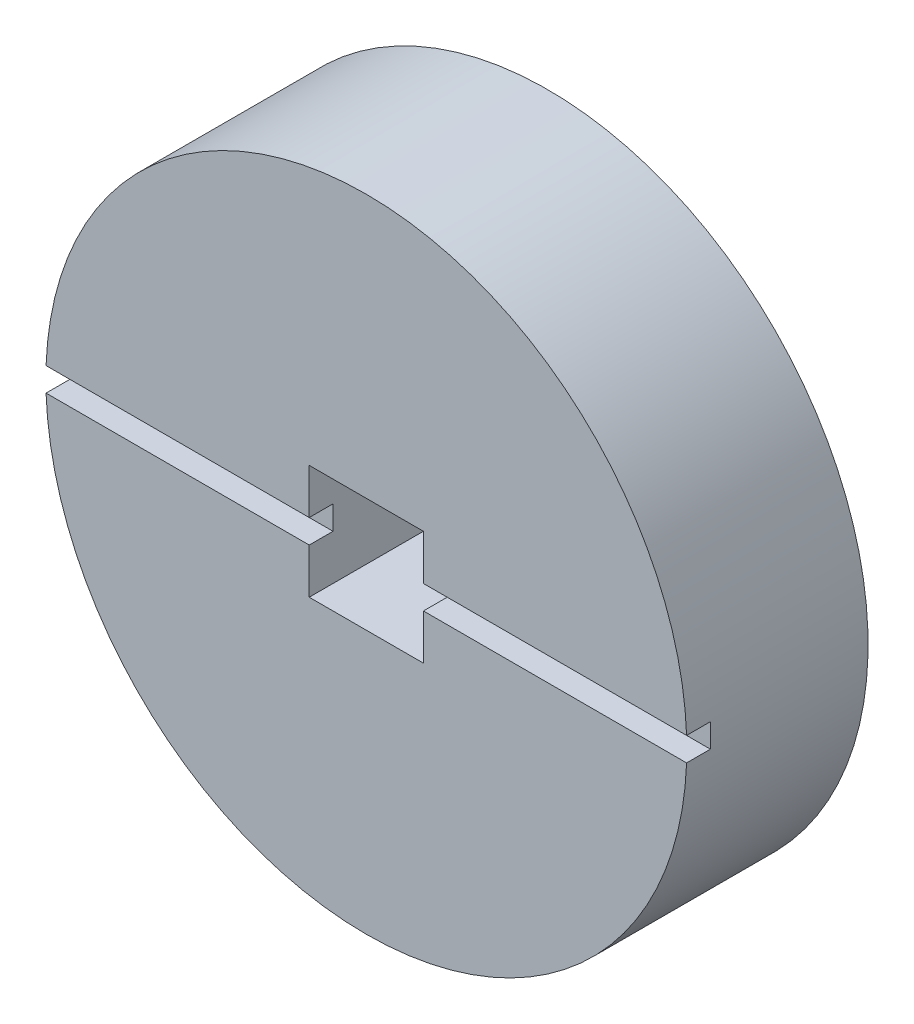
ISO-10303-21;
HEADER;
FILE_DESCRIPTION(('STEP AP214'),'2;1');
FILE_NAME('part.step','',(''),(''),'','','');
FILE_SCHEMA(('AUTOMOTIVE_DESIGN { 1 0 10303 214 1 1 1 1 }'));
ENDSEC;
DATA;
#1=APPLICATION_CONTEXT('core data for automotive mechanical design processes');
#2=APPLICATION_PROTOCOL_DEFINITION('international standard','automotive_design',2000,#1);
#3=PRODUCT_CONTEXT('',#1,'mechanical');
#4=PRODUCT('Part','Part','',(#3));
#5=PRODUCT_RELATED_PRODUCT_CATEGORY('part','',(#4));
#6=PRODUCT_DEFINITION_FORMATION('','',#4);
#7=PRODUCT_DEFINITION_CONTEXT('part definition',#1,'design');
#8=PRODUCT_DEFINITION('design','',#6,#7);
#9=PRODUCT_DEFINITION_SHAPE('','',#8);
#10=(LENGTH_UNIT() NAMED_UNIT(*) SI_UNIT(.MILLI.,.METRE.));
#11=(NAMED_UNIT(*) PLANE_ANGLE_UNIT() SI_UNIT($,.RADIAN.));
#12=(NAMED_UNIT(*) SI_UNIT($,.STERADIAN.) SOLID_ANGLE_UNIT());
#13=UNCERTAINTY_MEASURE_WITH_UNIT(LENGTH_MEASURE(1.E-05),#10,'distance_accuracy_value','');
#14=(GEOMETRIC_REPRESENTATION_CONTEXT(3) GLOBAL_UNCERTAINTY_ASSIGNED_CONTEXT((#13)) GLOBAL_UNIT_ASSIGNED_CONTEXT((#10,
#11,#12)) REPRESENTATION_CONTEXT('',''));
#15=CARTESIAN_POINT('',(0.,0.,0.));
#16=DIRECTION('',(0.,0.,1.));
#17=DIRECTION('',(1.,0.,0.));
#18=AXIS2_PLACEMENT_3D('',#15,#16,#17);
#19=CARTESIAN_POINT('',(176.372942693362,103.404109270251,-15.875));
#20=DIRECTION('',(0.,0.,1.));
#21=DIRECTION('',(1.,0.,0.));
#22=AXIS2_PLACEMENT_3D('',#19,#20,#21);
#23=PLANE('',#22);
#24=DIRECTION('',(1.,0.,0.));
#25=VECTOR('',#24,1.);
#26=CARTESIAN_POINT('',(162.750670816935,103.154109270251,-15.875));
#27=LINE('',#26,#25);
#28=CARTESIAN_POINT('',(169.641846837595,103.154109270251,-15.875));
#29=VERTEX_POINT('',#28);
#30=CARTESIAN_POINT('',(175.172942693362,103.154109270251,-15.875));
#31=VERTEX_POINT('',#30);
#32=EDGE_CURVE('E177',#29,#31,#27,.T.);
#33=ORIENTED_EDGE('',*,*,#32,.F.);
#34=CARTESIAN_POINT('',(176.372942693362,103.404109270251,-15.875));
#35=DIRECTION('',(0.,0.,1.));
#36=DIRECTION('',(1.,0.,0.));
#37=AXIS2_PLACEMENT_3D('',#34,#35,#36);
#38=CIRCLE('',#37,6.73573688764091);
#39=CARTESIAN_POINT('',(183.104038549129,103.154109270251,-15.875));
#40=VERTEX_POINT('',#39);
#41=EDGE_CURVE('E149',#29,#40,#38,.T.);
#42=ORIENTED_EDGE('',*,*,#41,.T.);
#43=CARTESIAN_POINT('',(177.572942693362,103.154109270251,-15.875));
#44=VERTEX_POINT('',#43);
#45=EDGE_CURVE('E140',#44,#40,#27,.T.);
#46=ORIENTED_EDGE('',*,*,#45,.F.);
#47=DIRECTION('',(0.,1.,0.));
#48=VECTOR('',#47,1.);
#49=CARTESIAN_POINT('',(177.572942693362,104.604109270251,-15.875));
#50=LINE('',#49,#48);
#51=CARTESIAN_POINT('',(177.572942693362,102.204109270251,-15.875));
#52=VERTEX_POINT('',#51);
#53=EDGE_CURVE('E205',#52,#44,#50,.T.);
#54=ORIENTED_EDGE('',*,*,#53,.F.);
#55=DIRECTION('',(1.,0.,0.));
#56=VECTOR('',#55,1.);
#57=CARTESIAN_POINT('',(175.172942693362,102.204109270251,-15.875));
#58=LINE('',#57,#56);
#59=CARTESIAN_POINT('',(175.172942693362,102.204109270251,-15.875));
#60=VERTEX_POINT('',#59);
#61=EDGE_CURVE('E196',#60,#52,#58,.T.);
#62=ORIENTED_EDGE('',*,*,#61,.F.);
#63=DIRECTION('',(0.,-1.,0.));
#64=VECTOR('',#63,1.);
#65=CARTESIAN_POINT('',(175.172942693362,104.604109270251,-15.875));
#66=LINE('',#65,#64);
#67=EDGE_CURVE('E211',#31,#60,#66,.T.);
#68=ORIENTED_EDGE('',*,*,#67,.F.);
#69=EDGE_LOOP('',(#33,#42,#46,#54,#62,#68));
#70=FACE_BOUND('',#69,.T.);
#71=ADVANCED_FACE('F33',(#70),#23,.T.);
#72=CARTESIAN_POINT('',(208.28,20.6375,-19.685));
#73=DIRECTION('',(0.,0.,-1.));
#74=DIRECTION('',(-1.,0.,0.));
#75=AXIS2_PLACEMENT_3D('',#72,#73,#74);
#76=PLANE('',#75);
#77=CARTESIAN_POINT('',(176.372942693362,103.404109270251,-19.685));
#78=DIRECTION('',(0.,0.,-1.));
#79=DIRECTION('',(-1.,0.,0.));
#80=AXIS2_PLACEMENT_3D('',#77,#78,#79);
#81=CIRCLE('',#80,6.73573688764091);
#82=CARTESIAN_POINT('',(169.637205805721,103.404109270251,-19.685));
#83=VERTEX_POINT('',#82);
#84=EDGE_CURVE('E148',#83,#83,#81,.F.);
#85=ORIENTED_EDGE('',*,*,#84,.F.);
#86=EDGE_LOOP('',(#85));
#87=FACE_BOUND('',#86,.T.);
#88=ADVANCED_FACE('F35',(#87),#76,.T.);
#89=DIRECTION('',(-1.,0.,0.));
#90=VECTOR('',#89,1.);
#91=CARTESIAN_POINT('',(162.750670816935,103.654109270251,-15.875));
#92=LINE('',#91,#90);
#93=CARTESIAN_POINT('',(183.104038549129,103.654109270251,-15.875));
#94=VERTEX_POINT('',#93);
#95=CARTESIAN_POINT('',(177.572942693362,103.654109270251,-15.875));
#96=VERTEX_POINT('',#95);
#97=EDGE_CURVE('E124',#94,#96,#92,.T.);
#98=ORIENTED_EDGE('',*,*,#97,.F.);
#99=CARTESIAN_POINT('',(169.641846837595,103.654109270251,-15.875));
#100=VERTEX_POINT('',#99);
#101=EDGE_CURVE('E137',#94,#100,#38,.T.);
#102=ORIENTED_EDGE('',*,*,#101,.T.);
#103=CARTESIAN_POINT('',(175.172942693362,103.654109270251,-15.875));
#104=VERTEX_POINT('',#103);
#105=EDGE_CURVE('E141',#104,#100,#92,.T.);
#106=ORIENTED_EDGE('',*,*,#105,.F.);
#107=CARTESIAN_POINT('',(175.172942693362,104.604109270251,-15.875));
#108=VERTEX_POINT('',#107);
#109=EDGE_CURVE('E166',#108,#104,#66,.T.);
#110=ORIENTED_EDGE('',*,*,#109,.F.);
#111=DIRECTION('',(-1.,0.,0.));
#112=VECTOR('',#111,1.);
#113=CARTESIAN_POINT('',(175.172942693362,104.604109270251,-15.875));
#114=LINE('',#113,#112);
#115=CARTESIAN_POINT('',(177.572942693362,104.604109270251,-15.875));
#116=VERTEX_POINT('',#115);
#117=EDGE_CURVE('E208',#116,#108,#114,.T.);
#118=ORIENTED_EDGE('',*,*,#117,.F.);
#119=EDGE_CURVE('E139',#96,#116,#50,.T.);
#120=ORIENTED_EDGE('',*,*,#119,.F.);
#121=EDGE_LOOP('',(#98,#102,#106,#110,#118,#120));
#122=FACE_BOUND('',#121,.T.);
#123=ADVANCED_FACE('F135',(#122),#23,.T.);
#124=CARTESIAN_POINT('',(176.372942693362,103.404109270251,-38.736540918157));
#125=DIRECTION('',(0.,0.,1.));
#126=DIRECTION('',(1.,0.,0.));
#127=AXIS2_PLACEMENT_3D('',#124,#125,#126);
#128=CYLINDRICAL_SURFACE('',#127,6.73573688764091);
#129=DIRECTION('',(0.,0.,1.));
#130=VECTOR('',#129,1.);
#131=CARTESIAN_POINT('',(169.641846837595,103.154109270251,-38.736540918157));
#132=LINE('',#131,#130);
#133=CARTESIAN_POINT('',(169.641846837595,103.154109270251,-16.375));
#134=VERTEX_POINT('',#133);
#135=EDGE_CURVE('E188',#134,#29,#132,.T.);
#136=ORIENTED_EDGE('',*,*,#135,.F.);
#137=CARTESIAN_POINT('',(176.372942693362,103.404109270251,-16.375));
#138=DIRECTION('',(0.,0.,1.));
#139=DIRECTION('',(1.,0.,0.));
#140=AXIS2_PLACEMENT_3D('',#137,#138,#139);
#141=CIRCLE('',#140,6.73573688764091);
#142=CARTESIAN_POINT('',(169.641846837595,103.654109270251,-16.375));
#143=VERTEX_POINT('',#142);
#144=EDGE_CURVE('E182',#134,#143,#141,.F.);
#145=ORIENTED_EDGE('',*,*,#144,.T.);
#146=DIRECTION('',(0.,0.,1.));
#147=VECTOR('',#146,1.);
#148=CARTESIAN_POINT('',(169.641846837595,103.654109270251,-38.736540918157));
#149=LINE('',#148,#147);
#150=EDGE_CURVE('E129',#100,#143,#149,.F.);
#151=ORIENTED_EDGE('',*,*,#150,.F.);
#152=ORIENTED_EDGE('',*,*,#101,.F.);
#153=DIRECTION('',(0.,0.,1.));
#154=VECTOR('',#153,1.);
#155=CARTESIAN_POINT('',(183.104038549129,103.654109270251,-38.736540918157));
#156=LINE('',#155,#154);
#157=CARTESIAN_POINT('',(183.104038549129,103.654109270251,-16.375));
#158=VERTEX_POINT('',#157);
#159=EDGE_CURVE('E121',#158,#94,#156,.T.);
#160=ORIENTED_EDGE('',*,*,#159,.F.);
#161=CARTESIAN_POINT('',(183.104038549129,103.154109270251,-16.375));
#162=VERTEX_POINT('',#161);
#163=EDGE_CURVE('E180',#158,#162,#141,.F.);
#164=ORIENTED_EDGE('',*,*,#163,.T.);
#165=DIRECTION('',(0.,0.,1.));
#166=VECTOR('',#165,1.);
#167=CARTESIAN_POINT('',(183.104038549129,103.154109270251,-38.736540918157));
#168=LINE('',#167,#166);
#169=EDGE_CURVE('E190',#40,#162,#168,.F.);
#170=ORIENTED_EDGE('',*,*,#169,.F.);
#171=ORIENTED_EDGE('',*,*,#41,.F.);
#172=EDGE_LOOP('',(#136,#145,#151,#152,#160,#164,#170,#171));
#173=FACE_BOUND('',#172,.T.);
#174=ORIENTED_EDGE('',*,*,#84,.T.);
#175=EDGE_LOOP('',(#174));
#176=FACE_BOUND('',#175,.T.);
#177=ADVANCED_FACE('F145',(#173,#176),#128,.T.);
#178=CARTESIAN_POINT('',(177.572942693362,104.604109270251,-18.796));
#179=DIRECTION('',(1.,0.,0.));
#180=DIRECTION('',(0.,0.,-1.));
#181=AXIS2_PLACEMENT_3D('',#178,#179,#180);
#182=PLANE('',#181);
#183=ORIENTED_EDGE('',*,*,#53,.T.);
#184=DIRECTION('',(0.,0.,-1.));
#185=VECTOR('',#184,1.);
#186=CARTESIAN_POINT('',(177.572942693362,103.154109270251,-18.796));
#187=LINE('',#186,#185);
#188=CARTESIAN_POINT('',(177.572942693362,103.154109270251,-16.375));
#189=VERTEX_POINT('',#188);
#190=EDGE_CURVE('E185',#44,#189,#187,.T.);
#191=ORIENTED_EDGE('',*,*,#190,.T.);
#192=DIRECTION('',(0.,-1.,0.));
#193=VECTOR('',#192,1.);
#194=CARTESIAN_POINT('',(177.572942693362,104.604109270251,-16.375));
#195=LINE('',#194,#193);
#196=CARTESIAN_POINT('',(177.572942693362,103.654109270251,-16.375));
#197=VERTEX_POINT('',#196);
#198=EDGE_CURVE('E178',#197,#189,#195,.T.);
#199=ORIENTED_EDGE('',*,*,#198,.F.);
#200=DIRECTION('',(0.,0.,1.));
#201=VECTOR('',#200,1.);
#202=CARTESIAN_POINT('',(177.572942693362,103.654109270251,-18.796));
#203=LINE('',#202,#201);
#204=EDGE_CURVE('E130',#197,#96,#203,.T.);
#205=ORIENTED_EDGE('',*,*,#204,.T.);
#206=ORIENTED_EDGE('',*,*,#119,.T.);
#207=DIRECTION('',(0.,0.,1.));
#208=VECTOR('',#207,1.);
#209=CARTESIAN_POINT('',(177.572942693362,104.604109270251,-18.796));
#210=LINE('',#209,#208);
#211=CARTESIAN_POINT('',(177.572942693362,104.604109270251,-18.796));
#212=VERTEX_POINT('',#211);
#213=EDGE_CURVE('E157',#212,#116,#210,.T.);
#214=ORIENTED_EDGE('',*,*,#213,.F.);
#215=DIRECTION('',(0.,1.,0.));
#216=VECTOR('',#215,1.);
#217=CARTESIAN_POINT('',(177.572942693362,104.604109270251,-18.796));
#218=LINE('',#217,#216);
#219=CARTESIAN_POINT('',(177.572942693362,102.204109270251,-18.796));
#220=VERTEX_POINT('',#219);
#221=EDGE_CURVE('E192',#220,#212,#218,.T.);
#222=ORIENTED_EDGE('',*,*,#221,.F.);
#223=DIRECTION('',(0.,0.,1.));
#224=VECTOR('',#223,1.);
#225=CARTESIAN_POINT('',(177.572942693362,102.204109270251,-18.796));
#226=LINE('',#225,#224);
#227=EDGE_CURVE('E155',#220,#52,#226,.T.);
#228=ORIENTED_EDGE('',*,*,#227,.T.);
#229=EDGE_LOOP('',(#183,#191,#199,#205,#206,#214,#222,#228));
#230=FACE_BOUND('',#229,.T.);
#231=ADVANCED_FACE('F226',(#230),#182,.F.);
#232=CARTESIAN_POINT('',(175.172942693362,102.204109270251,-18.796));
#233=DIRECTION('',(0.,-1.,0.));
#234=DIRECTION('',(0.,0.,-1.));
#235=AXIS2_PLACEMENT_3D('',#232,#233,#234);
#236=PLANE('',#235);
#237=ORIENTED_EDGE('',*,*,#61,.T.);
#238=ORIENTED_EDGE('',*,*,#227,.F.);
#239=DIRECTION('',(1.,0.,0.));
#240=VECTOR('',#239,1.);
#241=CARTESIAN_POINT('',(175.172942693362,102.204109270251,-18.796));
#242=LINE('',#241,#240);
#243=CARTESIAN_POINT('',(175.172942693362,102.204109270251,-18.796));
#244=VERTEX_POINT('',#243);
#245=EDGE_CURVE('E202',#244,#220,#242,.T.);
#246=ORIENTED_EDGE('',*,*,#245,.F.);
#247=DIRECTION('',(0.,0.,1.));
#248=VECTOR('',#247,1.);
#249=CARTESIAN_POINT('',(175.172942693362,102.204109270251,-18.796));
#250=LINE('',#249,#248);
#251=EDGE_CURVE('E216',#244,#60,#250,.T.);
#252=ORIENTED_EDGE('',*,*,#251,.T.);
#253=EDGE_LOOP('',(#237,#238,#246,#252));
#254=FACE_BOUND('',#253,.T.);
#255=ADVANCED_FACE('F244',(#254),#236,.F.);
#256=CARTESIAN_POINT('',(175.172942693362,104.604109270251,-18.796));
#257=DIRECTION('',(-1.,0.,0.));
#258=DIRECTION('',(0.,0.,1.));
#259=AXIS2_PLACEMENT_3D('',#256,#257,#258);
#260=PLANE('',#259);
#261=DIRECTION('',(0.,1.,0.));
#262=VECTOR('',#261,1.);
#263=CARTESIAN_POINT('',(175.172942693362,104.604109270251,-16.375));
#264=LINE('',#263,#262);
#265=CARTESIAN_POINT('',(175.172942693362,103.154109270251,-16.375));
#266=VERTEX_POINT('',#265);
#267=CARTESIAN_POINT('',(175.172942693362,103.654109270251,-16.375));
#268=VERTEX_POINT('',#267);
#269=EDGE_CURVE('E152',#266,#268,#264,.T.);
#270=ORIENTED_EDGE('',*,*,#269,.F.);
#271=DIRECTION('',(0.,0.,1.));
#272=VECTOR('',#271,1.);
#273=CARTESIAN_POINT('',(175.172942693362,103.154109270251,-18.796));
#274=LINE('',#273,#272);
#275=EDGE_CURVE('E11',#266,#31,#274,.T.);
#276=ORIENTED_EDGE('',*,*,#275,.T.);
#277=ORIENTED_EDGE('',*,*,#67,.T.);
#278=ORIENTED_EDGE('',*,*,#251,.F.);
#279=DIRECTION('',(0.,-1.,0.));
#280=VECTOR('',#279,1.);
#281=CARTESIAN_POINT('',(175.172942693362,104.604109270251,-18.796));
#282=LINE('',#281,#280);
#283=CARTESIAN_POINT('',(175.172942693362,104.604109270251,-18.796));
#284=VERTEX_POINT('',#283);
#285=EDGE_CURVE('E199',#284,#244,#282,.T.);
#286=ORIENTED_EDGE('',*,*,#285,.F.);
#287=DIRECTION('',(0.,0.,1.));
#288=VECTOR('',#287,1.);
#289=CARTESIAN_POINT('',(175.172942693362,104.604109270251,-18.796));
#290=LINE('',#289,#288);
#291=EDGE_CURVE('E218',#284,#108,#290,.T.);
#292=ORIENTED_EDGE('',*,*,#291,.T.);
#293=ORIENTED_EDGE('',*,*,#109,.T.);
#294=DIRECTION('',(0.,0.,-1.));
#295=VECTOR('',#294,1.);
#296=CARTESIAN_POINT('',(175.172942693362,103.654109270251,-18.796));
#297=LINE('',#296,#295);
#298=EDGE_CURVE('E41',#104,#268,#297,.T.);
#299=ORIENTED_EDGE('',*,*,#298,.T.);
#300=EDGE_LOOP('',(#270,#276,#277,#278,#286,#292,#293,#299));
#301=FACE_BOUND('',#300,.T.);
#302=ADVANCED_FACE('F164',(#301),#260,.F.);
#303=CARTESIAN_POINT('',(175.172942693362,104.604109270251,-18.796));
#304=DIRECTION('',(0.,1.,0.));
#305=DIRECTION('',(0.,0.,1.));
#306=AXIS2_PLACEMENT_3D('',#303,#304,#305);
#307=PLANE('',#306);
#308=ORIENTED_EDGE('',*,*,#117,.T.);
#309=ORIENTED_EDGE('',*,*,#291,.F.);
#310=DIRECTION('',(-1.,0.,0.));
#311=VECTOR('',#310,1.);
#312=CARTESIAN_POINT('',(175.172942693362,104.604109270251,-18.796));
#313=LINE('',#312,#311);
#314=EDGE_CURVE('E195',#212,#284,#313,.T.);
#315=ORIENTED_EDGE('',*,*,#314,.F.);
#316=ORIENTED_EDGE('',*,*,#213,.T.);
#317=EDGE_LOOP('',(#308,#309,#315,#316));
#318=FACE_BOUND('',#317,.T.);
#319=ADVANCED_FACE('F223',(#318),#307,.F.);
#320=CARTESIAN_POINT('',(0.,0.,-18.796));
#321=DIRECTION('',(0.,0.,1.));
#322=DIRECTION('',(1.,0.,0.));
#323=AXIS2_PLACEMENT_3D('',#320,#321,#322);
#324=PLANE('',#323);
#325=ORIENTED_EDGE('',*,*,#221,.T.);
#326=ORIENTED_EDGE('',*,*,#314,.T.);
#327=ORIENTED_EDGE('',*,*,#285,.T.);
#328=ORIENTED_EDGE('',*,*,#245,.T.);
#329=EDGE_LOOP('',(#325,#326,#327,#328));
#330=FACE_BOUND('',#329,.T.);
#331=ADVANCED_FACE('F247',(#330),#324,.T.);
#332=CARTESIAN_POINT('',(0.,0.,-16.375));
#333=DIRECTION('',(0.,0.,1.));
#334=DIRECTION('',(1.,0.,0.));
#335=AXIS2_PLACEMENT_3D('',#332,#333,#334);
#336=PLANE('',#335);
#337=DIRECTION('',(1.,0.,0.));
#338=VECTOR('',#337,1.);
#339=CARTESIAN_POINT('',(162.750670816935,103.154109270251,-16.375));
#340=LINE('',#339,#338);
#341=EDGE_CURVE('E56',#134,#266,#340,.T.);
#342=ORIENTED_EDGE('',*,*,#341,.T.);
#343=ORIENTED_EDGE('',*,*,#269,.T.);
#344=DIRECTION('',(-1.,0.,0.));
#345=VECTOR('',#344,1.);
#346=CARTESIAN_POINT('',(162.750670816935,103.654109270251,-16.375));
#347=LINE('',#346,#345);
#348=EDGE_CURVE('E171',#268,#143,#347,.T.);
#349=ORIENTED_EDGE('',*,*,#348,.T.);
#350=ORIENTED_EDGE('',*,*,#144,.F.);
#351=EDGE_LOOP('',(#342,#343,#349,#350));
#352=FACE_BOUND('',#351,.T.);
#353=ADVANCED_FACE('F249',(#352),#336,.T.);
#354=CARTESIAN_POINT('',(162.750670816935,103.654109270251,-16.375));
#355=DIRECTION('',(0.,1.,0.));
#356=DIRECTION('',(0.,0.,1.));
#357=AXIS2_PLACEMENT_3D('',#354,#355,#356);
#358=PLANE('',#357);
#359=ORIENTED_EDGE('',*,*,#150,.T.);
#360=ORIENTED_EDGE('',*,*,#348,.F.);
#361=ORIENTED_EDGE('',*,*,#298,.F.);
#362=ORIENTED_EDGE('',*,*,#105,.T.);
#363=EDGE_LOOP('',(#359,#360,#361,#362));
#364=FACE_BOUND('',#363,.T.);
#365=ADVANCED_FACE('F169',(#364),#358,.F.);
#366=CARTESIAN_POINT('',(162.750670816935,103.154109270251,-16.375));
#367=DIRECTION('',(0.,-1.,0.));
#368=DIRECTION('',(0.,0.,-1.));
#369=AXIS2_PLACEMENT_3D('',#366,#367,#368);
#370=PLANE('',#369);
#371=ORIENTED_EDGE('',*,*,#135,.T.);
#372=ORIENTED_EDGE('',*,*,#32,.T.);
#373=ORIENTED_EDGE('',*,*,#275,.F.);
#374=ORIENTED_EDGE('',*,*,#341,.F.);
#375=EDGE_LOOP('',(#371,#372,#373,#374));
#376=FACE_BOUND('',#375,.T.);
#377=ADVANCED_FACE('F237',(#376),#370,.F.);
#378=ORIENTED_EDGE('',*,*,#169,.T.);
#379=EDGE_CURVE('E174',#189,#162,#340,.T.);
#380=ORIENTED_EDGE('',*,*,#379,.F.);
#381=ORIENTED_EDGE('',*,*,#190,.F.);
#382=ORIENTED_EDGE('',*,*,#45,.T.);
#383=EDGE_LOOP('',(#378,#380,#381,#382));
#384=FACE_BOUND('',#383,.T.);
#385=ADVANCED_FACE('F232',(#384),#370,.F.);
#386=ORIENTED_EDGE('',*,*,#159,.T.);
#387=ORIENTED_EDGE('',*,*,#97,.T.);
#388=ORIENTED_EDGE('',*,*,#204,.F.);
#389=EDGE_CURVE('E48',#158,#197,#347,.T.);
#390=ORIENTED_EDGE('',*,*,#389,.F.);
#391=EDGE_LOOP('',(#386,#387,#388,#390));
#392=FACE_BOUND('',#391,.T.);
#393=ADVANCED_FACE('F123',(#392),#358,.F.);
#394=ORIENTED_EDGE('',*,*,#389,.T.);
#395=ORIENTED_EDGE('',*,*,#198,.T.);
#396=ORIENTED_EDGE('',*,*,#379,.T.);
#397=ORIENTED_EDGE('',*,*,#163,.F.);
#398=EDGE_LOOP('',(#394,#395,#396,#397));
#399=FACE_BOUND('',#398,.T.);
#400=ADVANCED_FACE('F230',(#399),#336,.T.);
#401=CLOSED_SHELL('',(#71,#88,#123,#177,#231,#255,#302,#319,#331,#353,#365,#377,#385,#393,#400));
#402=MANIFOLD_SOLID_BREP('B2',#401);
#403=ADVANCED_BREP_SHAPE_REPRESENTATION('',(#18,#402),#14);
#404=SHAPE_DEFINITION_REPRESENTATION(#9,#403);
ENDSEC;
END-ISO-10303-21;
